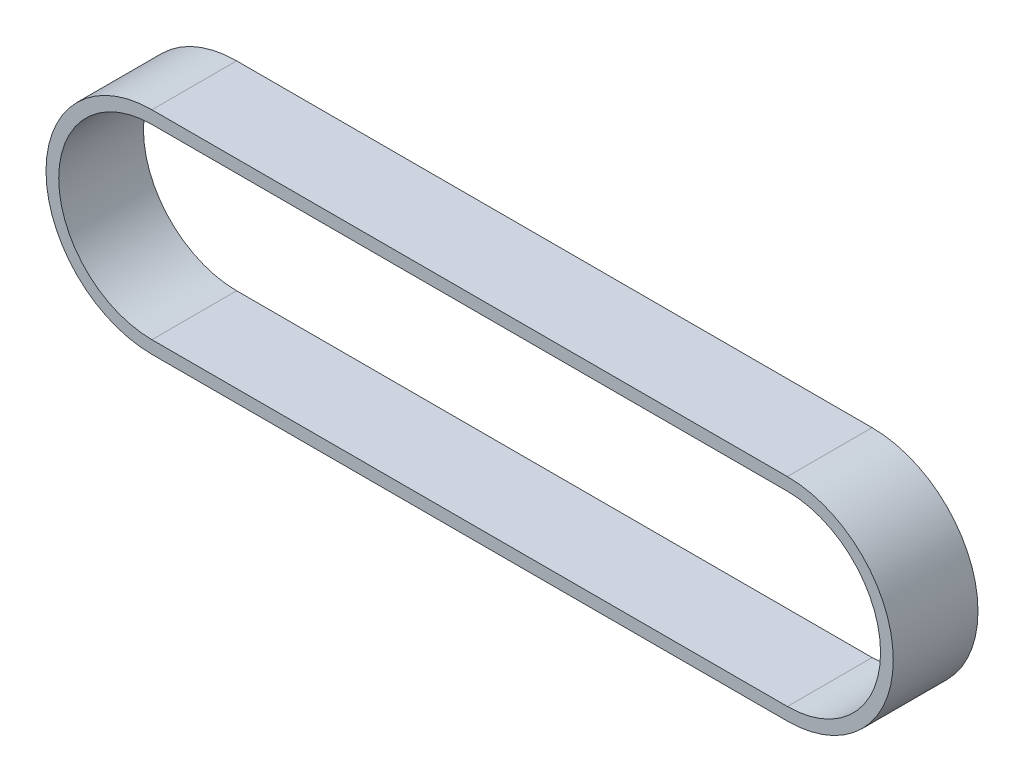
ISO-10303-21;
HEADER;
FILE_DESCRIPTION(('STEP AP214'),'2;1');
FILE_NAME('part.step','',(''),(''),'','','');
FILE_SCHEMA(('AUTOMOTIVE_DESIGN { 1 0 10303 214 1 1 1 1 }'));
ENDSEC;
DATA;
#1=APPLICATION_CONTEXT('core data for automotive mechanical design processes');
#2=APPLICATION_PROTOCOL_DEFINITION('international standard','automotive_design',2000,#1);
#3=PRODUCT_CONTEXT('',#1,'mechanical');
#4=PRODUCT('Part','Part','',(#3));
#5=PRODUCT_RELATED_PRODUCT_CATEGORY('part','',(#4));
#6=PRODUCT_DEFINITION_FORMATION('','',#4);
#7=PRODUCT_DEFINITION_CONTEXT('part definition',#1,'design');
#8=PRODUCT_DEFINITION('design','',#6,#7);
#9=PRODUCT_DEFINITION_SHAPE('','',#8);
#10=(LENGTH_UNIT() NAMED_UNIT(*) SI_UNIT(.MILLI.,.METRE.));
#11=(NAMED_UNIT(*) PLANE_ANGLE_UNIT() SI_UNIT($,.RADIAN.));
#12=(NAMED_UNIT(*) SI_UNIT($,.STERADIAN.) SOLID_ANGLE_UNIT());
#13=UNCERTAINTY_MEASURE_WITH_UNIT(LENGTH_MEASURE(1.E-05),#10,'distance_accuracy_value','');
#14=(GEOMETRIC_REPRESENTATION_CONTEXT(3) GLOBAL_UNCERTAINTY_ASSIGNED_CONTEXT((#13)) GLOBAL_UNIT_ASSIGNED_CONTEXT((#10,
#11,#12)) REPRESENTATION_CONTEXT('',''));
#15=CARTESIAN_POINT('',(0.,0.,0.));
#16=DIRECTION('',(0.,0.,1.));
#17=DIRECTION('',(1.,0.,0.));
#18=AXIS2_PLACEMENT_3D('',#15,#16,#17);
#19=CARTESIAN_POINT('',(-2.02615701994091E-12,4.76008121808036E-12,20.));
#20=DIRECTION('',(0.,0.,-1.));
#21=DIRECTION('',(-1.,0.,0.));
#22=AXIS2_PLACEMENT_3D('',#19,#20,#21);
#23=PLANE('',#22);
#24=CARTESIAN_POINT('',(-2.02615701994091E-12,4.76008121808036E-12,20.));
#25=DIRECTION('',(0.,0.,-1.));
#26=DIRECTION('',(-1.,0.,0.));
#27=AXIS2_PLACEMENT_3D('',#24,#25,#26);
#28=CIRCLE('',#27,50.);
#29=CARTESIAN_POINT('',(0.00704800781444613,-49.9999995032511,20.));
#30=VERTEX_POINT('',#29);
#31=CARTESIAN_POINT('',(-0.00704800781847759,49.9999995032606,20.));
#32=VERTEX_POINT('',#31);
#33=EDGE_CURVE('E160',#30,#32,#28,.F.);
#34=ORIENTED_EDGE('',*,*,#33,.T.);
#35=DIRECTION('',(-0.999999990065117,-0.000140960156329446,0.));
#36=VECTOR('',#35,1.);
#37=CARTESIAN_POINT('',(-0.00704800781849844,49.9999995032606,20.));
#38=LINE('',#37,#36);
#39=CARTESIAN_POINT('',(-300.007045027352,49.9577114563618,20.));
#40=VERTEX_POINT('',#39);
#41=EDGE_CURVE('E163',#32,#40,#38,.T.);
#42=ORIENTED_EDGE('',*,*,#41,.T.);
#43=CARTESIAN_POINT('',(-299.999997019535,-0.0422880468940734,20.));
#44=DIRECTION('',(0.,0.,-1.));
#45=DIRECTION('',(-1.,0.,0.));
#46=AXIS2_PLACEMENT_3D('',#43,#44,#45);
#47=CIRCLE('',#46,50.);
#48=CARTESIAN_POINT('',(-299.992949011719,-50.0422875501499,20.));
#49=VERTEX_POINT('',#48);
#50=EDGE_CURVE('E166',#40,#49,#47,.F.);
#51=ORIENTED_EDGE('',*,*,#50,.T.);
#52=DIRECTION('',(0.999999990065117,0.000140960156329446,0.));
#53=VECTOR('',#52,1.);
#54=CARTESIAN_POINT('',(0.00704800781444613,-49.9999995032511,20.));
#55=LINE('',#54,#53);
#56=EDGE_CURVE('E168',#49,#30,#55,.T.);
#57=ORIENTED_EDGE('',*,*,#56,.T.);
#58=EDGE_LOOP('',(#34,#42,#51,#57));
#59=FACE_BOUND('',#58,.T.);
#60=CARTESIAN_POINT('',(-2.02615701994091E-12,4.76008121808036E-12,20.));
#61=DIRECTION('',(0.,0.,1.));
#62=DIRECTION('',(-1.,0.,0.));
#63=AXIS2_PLACEMENT_3D('',#60,#61,#62);
#64=CIRCLE('',#63,44.);
#65=CARTESIAN_POINT('',(0.00620224687646945,-43.9999995628604,20.));
#66=VERTEX_POINT('',#65);
#67=CARTESIAN_POINT('',(-0.00620224688052177,43.9999995628699,20.));
#68=VERTEX_POINT('',#67);
#69=EDGE_CURVE('E124',#66,#68,#64,.T.);
#70=ORIENTED_EDGE('',*,*,#69,.F.);
#71=DIRECTION('',(0.999999990065117,0.000140960156329446,0.));
#72=VECTOR('',#71,1.);
#73=CARTESIAN_POINT('',(0.00620224687646945,-43.9999995628604,20.));
#74=LINE('',#73,#72);
#75=CARTESIAN_POINT('',(-299.993794772657,-44.0422876097592,20.));
#76=VERTEX_POINT('',#75);
#77=EDGE_CURVE('E146',#76,#66,#74,.T.);
#78=ORIENTED_EDGE('',*,*,#77,.F.);
#79=CARTESIAN_POINT('',(-299.999997019535,-0.0422880468940734,20.));
#80=DIRECTION('',(0.,0.,1.));
#81=DIRECTION('',(-1.,0.,0.));
#82=AXIS2_PLACEMENT_3D('',#79,#80,#81);
#83=CIRCLE('',#82,44.);
#84=CARTESIAN_POINT('',(-300.006199266414,43.9577115159711,20.));
#85=VERTEX_POINT('',#84);
#86=EDGE_CURVE('E144',#85,#76,#83,.T.);
#87=ORIENTED_EDGE('',*,*,#86,.F.);
#88=DIRECTION('',(-0.999999990065117,-0.000140960156329446,0.));
#89=VECTOR('',#88,1.);
#90=CARTESIAN_POINT('',(-300.006199266414,43.9577115159711,20.));
#91=LINE('',#90,#89);
#92=EDGE_CURVE('E132',#68,#85,#91,.T.);
#93=ORIENTED_EDGE('',*,*,#92,.F.);
#94=EDGE_LOOP('',(#70,#78,#87,#93));
#95=FACE_BOUND('',#94,.T.);
#96=ADVANCED_FACE('F59',(#59,#95),#23,.F.);
#97=CARTESIAN_POINT('',(-2.02615701994091E-12,4.76008121808036E-12,-20.));
#98=DIRECTION('',(0.,0.,-1.));
#99=DIRECTION('',(-1.,0.,0.));
#100=AXIS2_PLACEMENT_3D('',#97,#98,#99);
#101=PLANE('',#100);
#102=CARTESIAN_POINT('',(-2.02615701994091E-12,4.76008121808036E-12,-20.));
#103=DIRECTION('',(0.,0.,-1.));
#104=DIRECTION('',(-1.,0.,0.));
#105=AXIS2_PLACEMENT_3D('',#102,#103,#104);
#106=CIRCLE('',#105,50.);
#107=CARTESIAN_POINT('',(0.00704800781444613,-49.9999995032511,-20.));
#108=VERTEX_POINT('',#107);
#109=CARTESIAN_POINT('',(-0.00704800781847759,49.9999995032606,-20.));
#110=VERTEX_POINT('',#109);
#111=EDGE_CURVE('E140',#108,#110,#106,.F.);
#112=ORIENTED_EDGE('',*,*,#111,.F.);
#113=DIRECTION('',(0.999999990065117,0.000140960156329446,0.));
#114=VECTOR('',#113,1.);
#115=CARTESIAN_POINT('',(0.00704800781444613,-49.9999995032511,-20.));
#116=LINE('',#115,#114);
#117=CARTESIAN_POINT('',(-299.992949011719,-50.0422875501499,-20.));
#118=VERTEX_POINT('',#117);
#119=EDGE_CURVE('E164',#118,#108,#116,.T.);
#120=ORIENTED_EDGE('',*,*,#119,.F.);
#121=CARTESIAN_POINT('',(-299.999997019535,-0.0422880468940734,-20.));
#122=DIRECTION('',(0.,0.,-1.));
#123=DIRECTION('',(-1.,0.,0.));
#124=AXIS2_PLACEMENT_3D('',#121,#122,#123);
#125=CIRCLE('',#124,50.);
#126=CARTESIAN_POINT('',(-300.007045027352,49.9577114563618,-20.));
#127=VERTEX_POINT('',#126);
#128=EDGE_CURVE('E175',#127,#118,#125,.F.);
#129=ORIENTED_EDGE('',*,*,#128,.F.);
#130=DIRECTION('',(-0.999999990065117,-0.000140960156329446,0.));
#131=VECTOR('',#130,1.);
#132=CARTESIAN_POINT('',(-0.00704800781849844,49.9999995032606,-20.));
#133=LINE('',#132,#131);
#134=EDGE_CURVE('E173',#110,#127,#133,.T.);
#135=ORIENTED_EDGE('',*,*,#134,.F.);
#136=EDGE_LOOP('',(#112,#120,#129,#135));
#137=FACE_BOUND('',#136,.T.);
#138=DIRECTION('',(0.999999990065117,0.000140960156329446,0.));
#139=VECTOR('',#138,1.);
#140=CARTESIAN_POINT('',(0.00620224687646945,-43.9999995628604,-20.));
#141=LINE('',#140,#139);
#142=CARTESIAN_POINT('',(-299.993794772657,-44.0422876097592,-20.));
#143=VERTEX_POINT('',#142);
#144=CARTESIAN_POINT('',(0.00620224687646945,-43.9999995628604,-20.));
#145=VERTEX_POINT('',#144);
#146=EDGE_CURVE('E133',#143,#145,#141,.T.);
#147=ORIENTED_EDGE('',*,*,#146,.T.);
#148=CARTESIAN_POINT('',(-2.02615701994091E-12,4.76008121808036E-12,-20.));
#149=DIRECTION('',(0.,0.,1.));
#150=DIRECTION('',(-1.,0.,0.));
#151=AXIS2_PLACEMENT_3D('',#148,#149,#150);
#152=CIRCLE('',#151,44.);
#153=CARTESIAN_POINT('',(-0.00620224688052177,43.9999995628699,-20.));
#154=VERTEX_POINT('',#153);
#155=EDGE_CURVE('E82',#145,#154,#152,.T.);
#156=ORIENTED_EDGE('',*,*,#155,.T.);
#157=DIRECTION('',(-0.999999990065117,-0.000140960156329446,0.));
#158=VECTOR('',#157,1.);
#159=CARTESIAN_POINT('',(-300.006199266414,43.9577115159711,-20.));
#160=LINE('',#159,#158);
#161=CARTESIAN_POINT('',(-300.006199266414,43.9577115159711,-20.));
#162=VERTEX_POINT('',#161);
#163=EDGE_CURVE('E139',#154,#162,#160,.T.);
#164=ORIENTED_EDGE('',*,*,#163,.T.);
#165=CARTESIAN_POINT('',(-299.999997019535,-0.0422880468940734,-20.));
#166=DIRECTION('',(0.,0.,1.));
#167=DIRECTION('',(-1.,0.,0.));
#168=AXIS2_PLACEMENT_3D('',#165,#166,#167);
#169=CIRCLE('',#168,44.);
#170=EDGE_CURVE('E152',#162,#143,#169,.T.);
#171=ORIENTED_EDGE('',*,*,#170,.T.);
#172=EDGE_LOOP('',(#147,#156,#164,#171));
#173=FACE_BOUND('',#172,.T.);
#174=ADVANCED_FACE('F193',(#137,#173),#101,.T.);
#175=CARTESIAN_POINT('',(-2.02615701994091E-12,4.76008121808036E-12,20.));
#176=DIRECTION('',(0.,0.,-1.));
#177=DIRECTION('',(-1.,0.,0.));
#178=AXIS2_PLACEMENT_3D('',#175,#176,#177);
#179=CYLINDRICAL_SURFACE('',#178,50.);
#180=ORIENTED_EDGE('',*,*,#111,.T.);
#181=DIRECTION('',(0.,0.,-1.));
#182=VECTOR('',#181,1.);
#183=CARTESIAN_POINT('',(-0.00704800781847759,49.9999995032606,20.));
#184=LINE('',#183,#182);
#185=EDGE_CURVE('E12',#32,#110,#184,.T.);
#186=ORIENTED_EDGE('',*,*,#185,.F.);
#187=ORIENTED_EDGE('',*,*,#33,.F.);
#188=DIRECTION('',(0.,0.,-1.));
#189=VECTOR('',#188,1.);
#190=CARTESIAN_POINT('',(0.00704800781444613,-49.9999995032511,20.));
#191=LINE('',#190,#189);
#192=EDGE_CURVE('E170',#30,#108,#191,.T.);
#193=ORIENTED_EDGE('',*,*,#192,.T.);
#194=EDGE_LOOP('',(#180,#186,#187,#193));
#195=FACE_BOUND('',#194,.T.);
#196=ADVANCED_FACE('F61',(#195),#179,.T.);
#197=CARTESIAN_POINT('',(-0.00704800781849844,49.9999995032606,20.));
#198=DIRECTION('',(0.000140960156329446,-0.999999990065117,0.));
#199=DIRECTION('',(0.999999990065117,0.000140960156329446,0.));
#200=AXIS2_PLACEMENT_3D('',#197,#198,#199);
#201=PLANE('',#200);
#202=ORIENTED_EDGE('',*,*,#134,.T.);
#203=DIRECTION('',(0.,0.,-1.));
#204=VECTOR('',#203,1.);
#205=CARTESIAN_POINT('',(-300.007045027352,49.9577114563618,20.));
#206=LINE('',#205,#204);
#207=EDGE_CURVE('E67',#40,#127,#206,.T.);
#208=ORIENTED_EDGE('',*,*,#207,.F.);
#209=ORIENTED_EDGE('',*,*,#41,.F.);
#210=ORIENTED_EDGE('',*,*,#185,.T.);
#211=EDGE_LOOP('',(#202,#208,#209,#210));
#212=FACE_BOUND('',#211,.T.);
#213=ADVANCED_FACE('F203',(#212),#201,.F.);
#214=CARTESIAN_POINT('',(-299.999997019535,-0.0422880468940734,20.));
#215=DIRECTION('',(0.,0.,-1.));
#216=DIRECTION('',(-1.,0.,0.));
#217=AXIS2_PLACEMENT_3D('',#214,#215,#216);
#218=CYLINDRICAL_SURFACE('',#217,50.);
#219=ORIENTED_EDGE('',*,*,#128,.T.);
#220=DIRECTION('',(0.,0.,-1.));
#221=VECTOR('',#220,1.);
#222=CARTESIAN_POINT('',(-299.992949011719,-50.0422875501499,20.));
#223=LINE('',#222,#221);
#224=EDGE_CURVE('E180',#49,#118,#223,.T.);
#225=ORIENTED_EDGE('',*,*,#224,.F.);
#226=ORIENTED_EDGE('',*,*,#50,.F.);
#227=ORIENTED_EDGE('',*,*,#207,.T.);
#228=EDGE_LOOP('',(#219,#225,#226,#227));
#229=FACE_BOUND('',#228,.T.);
#230=ADVANCED_FACE('F187',(#229),#218,.T.);
#231=CARTESIAN_POINT('',(0.00704800781444613,-49.9999995032511,20.));
#232=DIRECTION('',(-0.000140960156329446,0.999999990065117,0.));
#233=DIRECTION('',(-0.999999990065117,-0.000140960156329446,0.));
#234=AXIS2_PLACEMENT_3D('',#231,#232,#233);
#235=PLANE('',#234);
#236=ORIENTED_EDGE('',*,*,#119,.T.);
#237=ORIENTED_EDGE('',*,*,#192,.F.);
#238=ORIENTED_EDGE('',*,*,#56,.F.);
#239=ORIENTED_EDGE('',*,*,#224,.T.);
#240=EDGE_LOOP('',(#236,#237,#238,#239));
#241=FACE_BOUND('',#240,.T.);
#242=ADVANCED_FACE('F197',(#241),#235,.F.);
#243=CARTESIAN_POINT('',(-2.02615701994091E-12,4.76008121808036E-12,20.));
#244=DIRECTION('',(0.,0.,-1.));
#245=DIRECTION('',(-1.,0.,0.));
#246=AXIS2_PLACEMENT_3D('',#243,#244,#245);
#247=CYLINDRICAL_SURFACE('',#246,44.);
#248=ORIENTED_EDGE('',*,*,#155,.F.);
#249=DIRECTION('',(0.,0.,-1.));
#250=VECTOR('',#249,1.);
#251=CARTESIAN_POINT('',(0.00620224687646945,-43.9999995628604,20.));
#252=LINE('',#251,#250);
#253=EDGE_CURVE('E128',#66,#145,#252,.T.);
#254=ORIENTED_EDGE('',*,*,#253,.F.);
#255=ORIENTED_EDGE('',*,*,#69,.T.);
#256=DIRECTION('',(0.,0.,-1.));
#257=VECTOR('',#256,1.);
#258=CARTESIAN_POINT('',(-0.00620224688052177,43.9999995628699,20.));
#259=LINE('',#258,#257);
#260=EDGE_CURVE('E127',#68,#154,#259,.T.);
#261=ORIENTED_EDGE('',*,*,#260,.T.);
#262=EDGE_LOOP('',(#248,#254,#255,#261));
#263=FACE_BOUND('',#262,.T.);
#264=ADVANCED_FACE('F126',(#263),#247,.F.);
#265=CARTESIAN_POINT('',(-300.006199266414,43.9577115159711,20.));
#266=DIRECTION('',(0.000140960156329446,-0.999999990065117,0.));
#267=DIRECTION('',(0.999999990065117,0.000140960156329446,0.));
#268=AXIS2_PLACEMENT_3D('',#265,#266,#267);
#269=PLANE('',#268);
#270=ORIENTED_EDGE('',*,*,#163,.F.);
#271=ORIENTED_EDGE('',*,*,#260,.F.);
#272=ORIENTED_EDGE('',*,*,#92,.T.);
#273=DIRECTION('',(0.,0.,-1.));
#274=VECTOR('',#273,1.);
#275=CARTESIAN_POINT('',(-300.006199266414,43.9577115159711,20.));
#276=LINE('',#275,#274);
#277=EDGE_CURVE('E141',#85,#162,#276,.T.);
#278=ORIENTED_EDGE('',*,*,#277,.T.);
#279=EDGE_LOOP('',(#270,#271,#272,#278));
#280=FACE_BOUND('',#279,.T.);
#281=ADVANCED_FACE('F136',(#280),#269,.T.);
#282=CARTESIAN_POINT('',(-299.999997019535,-0.0422880468940734,20.));
#283=DIRECTION('',(0.,0.,-1.));
#284=DIRECTION('',(-1.,0.,0.));
#285=AXIS2_PLACEMENT_3D('',#282,#283,#284);
#286=CYLINDRICAL_SURFACE('',#285,44.);
#287=ORIENTED_EDGE('',*,*,#170,.F.);
#288=ORIENTED_EDGE('',*,*,#277,.F.);
#289=ORIENTED_EDGE('',*,*,#86,.T.);
#290=DIRECTION('',(0.,0.,-1.));
#291=VECTOR('',#290,1.);
#292=CARTESIAN_POINT('',(-299.993794772657,-44.0422876097592,20.));
#293=LINE('',#292,#291);
#294=EDGE_CURVE('E74',#76,#143,#293,.T.);
#295=ORIENTED_EDGE('',*,*,#294,.T.);
#296=EDGE_LOOP('',(#287,#288,#289,#295));
#297=FACE_BOUND('',#296,.T.);
#298=ADVANCED_FACE('F226',(#297),#286,.F.);
#299=CARTESIAN_POINT('',(0.00620224687646945,-43.9999995628604,20.));
#300=DIRECTION('',(-0.000140960156329446,0.999999990065117,0.));
#301=DIRECTION('',(-0.999999990065117,-0.000140960156329446,0.));
#302=AXIS2_PLACEMENT_3D('',#299,#300,#301);
#303=PLANE('',#302);
#304=ORIENTED_EDGE('',*,*,#146,.F.);
#305=ORIENTED_EDGE('',*,*,#294,.F.);
#306=ORIENTED_EDGE('',*,*,#77,.T.);
#307=ORIENTED_EDGE('',*,*,#253,.T.);
#308=EDGE_LOOP('',(#304,#305,#306,#307));
#309=FACE_BOUND('',#308,.T.);
#310=ADVANCED_FACE('F230',(#309),#303,.T.);
#311=CLOSED_SHELL('',(#96,#174,#196,#213,#230,#242,#264,#281,#298,#310));
#312=MANIFOLD_SOLID_BREP('B2',#311);
#313=ADVANCED_BREP_SHAPE_REPRESENTATION('',(#18,#312),#14);
#314=SHAPE_DEFINITION_REPRESENTATION(#9,#313);
ENDSEC;
END-ISO-10303-21;
